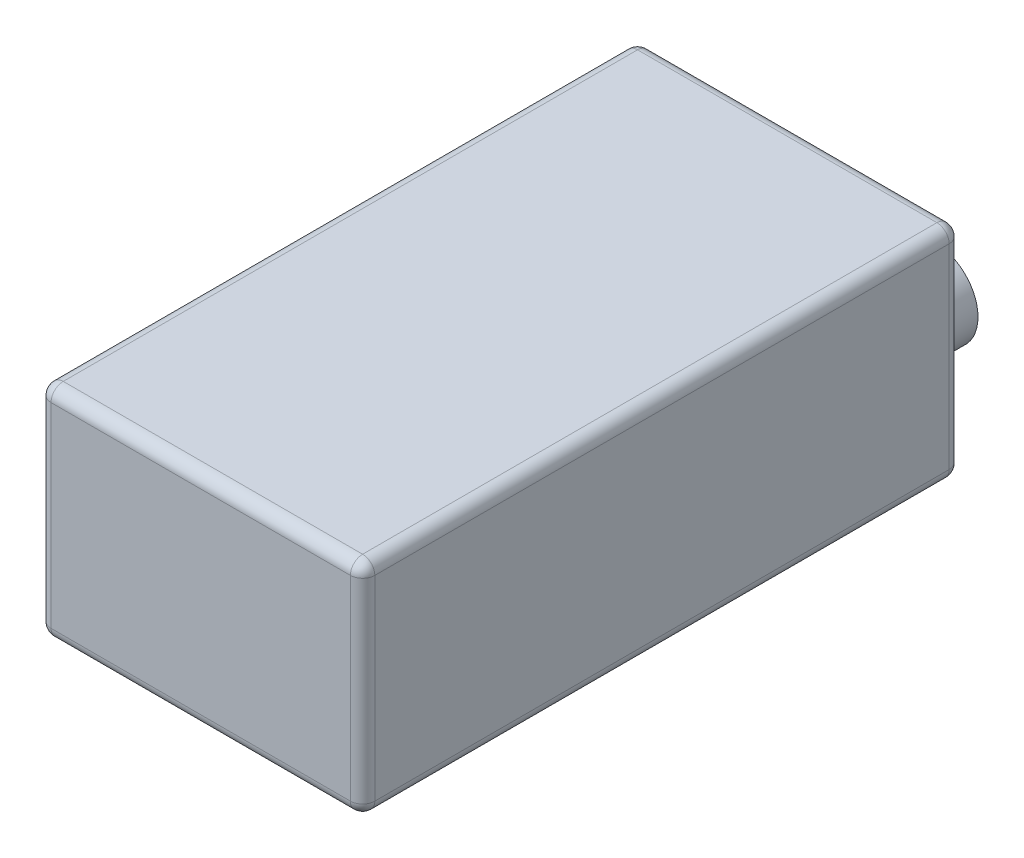
ISO-10303-21;
HEADER;
FILE_DESCRIPTION(('STEP AP214'),'2;1');
FILE_NAME('part.step','',(''),(''),'','','');
FILE_SCHEMA(('AUTOMOTIVE_DESIGN { 1 0 10303 214 1 1 1 1 }'));
ENDSEC;
DATA;
#1=APPLICATION_CONTEXT('core data for automotive mechanical design processes');
#2=APPLICATION_PROTOCOL_DEFINITION('international standard','automotive_design',2000,#1);
#3=PRODUCT_CONTEXT('',#1,'mechanical');
#4=PRODUCT('Part','Part','',(#3));
#5=PRODUCT_RELATED_PRODUCT_CATEGORY('part','',(#4));
#6=PRODUCT_DEFINITION_FORMATION('','',#4);
#7=PRODUCT_DEFINITION_CONTEXT('part definition',#1,'design');
#8=PRODUCT_DEFINITION('design','',#6,#7);
#9=PRODUCT_DEFINITION_SHAPE('','',#8);
#10=(LENGTH_UNIT() NAMED_UNIT(*) SI_UNIT(.MILLI.,.METRE.));
#11=(NAMED_UNIT(*) PLANE_ANGLE_UNIT() SI_UNIT($,.RADIAN.));
#12=(NAMED_UNIT(*) SI_UNIT($,.STERADIAN.) SOLID_ANGLE_UNIT());
#13=UNCERTAINTY_MEASURE_WITH_UNIT(LENGTH_MEASURE(1.E-05),#10,'distance_accuracy_value','');
#14=(GEOMETRIC_REPRESENTATION_CONTEXT(3) GLOBAL_UNCERTAINTY_ASSIGNED_CONTEXT((#13)) GLOBAL_UNIT_ASSIGNED_CONTEXT((#10,
#11,#12)) REPRESENTATION_CONTEXT('',''));
#15=CARTESIAN_POINT('',(0.,0.,0.));
#16=DIRECTION('',(0.,0.,1.));
#17=DIRECTION('',(1.,0.,0.));
#18=AXIS2_PLACEMENT_3D('',#15,#16,#17);
#19=CARTESIAN_POINT('',(13.25,18.,-24.5));
#20=DIRECTION('',(-1.,0.,0.));
#21=DIRECTION('',(0.,0.,1.));
#22=AXIS2_PLACEMENT_3D('',#19,#20,#21);
#23=PLANE('',#22);
#24=DIRECTION('',(0.,0.,-1.));
#25=VECTOR('',#24,1.);
#26=CARTESIAN_POINT('',(13.25,17.,24.5));
#27=LINE('',#26,#25);
#28=CARTESIAN_POINT('',(13.25,17.,-23.5));
#29=VERTEX_POINT('',#28);
#30=CARTESIAN_POINT('',(13.25,17.,23.5));
#31=VERTEX_POINT('',#30);
#32=EDGE_CURVE('E205',#29,#31,#27,.F.);
#33=ORIENTED_EDGE('',*,*,#32,.T.);
#34=DIRECTION('',(0.,-1.,0.));
#35=VECTOR('',#34,1.);
#36=CARTESIAN_POINT('',(13.25,18.,23.5));
#37=LINE('',#36,#35);
#38=CARTESIAN_POINT('',(13.25,1.,23.5));
#39=VERTEX_POINT('',#38);
#40=EDGE_CURVE('E212',#31,#39,#37,.T.);
#41=ORIENTED_EDGE('',*,*,#40,.T.);
#42=DIRECTION('',(0.,0.,-1.));
#43=VECTOR('',#42,1.);
#44=CARTESIAN_POINT('',(13.25,1.,-24.5));
#45=LINE('',#44,#43);
#46=CARTESIAN_POINT('',(13.25,1.,-23.5));
#47=VERTEX_POINT('',#46);
#48=EDGE_CURVE('E208',#39,#47,#45,.T.);
#49=ORIENTED_EDGE('',*,*,#48,.T.);
#50=DIRECTION('',(0.,-1.,0.));
#51=VECTOR('',#50,1.);
#52=CARTESIAN_POINT('',(13.25,18.,-23.5));
#53=LINE('',#52,#51);
#54=EDGE_CURVE('E202',#47,#29,#53,.F.);
#55=ORIENTED_EDGE('',*,*,#54,.T.);
#56=EDGE_LOOP('',(#33,#41,#49,#55));
#57=FACE_BOUND('',#56,.T.);
#58=ADVANCED_FACE('F39',(#57),#23,.F.);
#59=CARTESIAN_POINT('',(-13.25,18.,-24.5));
#60=DIRECTION('',(0.,0.,1.));
#61=DIRECTION('',(1.,0.,0.));
#62=AXIS2_PLACEMENT_3D('',#59,#60,#61);
#63=PLANE('',#62);
#64=CARTESIAN_POINT('',(-8.11326772272302,9.,-24.5));
#65=DIRECTION('',(0.,0.,1.));
#66=DIRECTION('',(1.,0.,0.));
#67=AXIS2_PLACEMENT_3D('',#64,#65,#66);
#68=CIRCLE('',#67,3.5);
#69=CARTESIAN_POINT('',(-4.61326772272302,9.,-24.5));
#70=VERTEX_POINT('',#69);
#71=EDGE_CURVE('E512',#70,#70,#68,.T.);
#72=ORIENTED_EDGE('',*,*,#71,.T.);
#73=EDGE_LOOP('',(#72));
#74=FACE_BOUND('',#73,.T.);
#75=CARTESIAN_POINT('',(8.11326772272302,9.,-24.5));
#76=DIRECTION('',(0.,0.,1.));
#77=DIRECTION('',(1.,0.,0.));
#78=AXIS2_PLACEMENT_3D('',#75,#76,#77);
#79=CIRCLE('',#78,3.5);
#80=CARTESIAN_POINT('',(11.613267722723,9.,-24.5));
#81=VERTEX_POINT('',#80);
#82=EDGE_CURVE('E11',#81,#81,#79,.F.);
#83=ORIENTED_EDGE('',*,*,#82,.F.);
#84=EDGE_LOOP('',(#83));
#85=FACE_BOUND('',#84,.T.);
#86=DIRECTION('',(0.,-1.,0.));
#87=VECTOR('',#86,1.);
#88=CARTESIAN_POINT('',(12.25,18.,-24.5));
#89=LINE('',#88,#87);
#90=CARTESIAN_POINT('',(12.25,17.,-24.5));
#91=VERTEX_POINT('',#90);
#92=CARTESIAN_POINT('',(12.25,1.,-24.5));
#93=VERTEX_POINT('',#92);
#94=EDGE_CURVE('E135',#91,#93,#89,.T.);
#95=ORIENTED_EDGE('',*,*,#94,.T.);
#96=DIRECTION('',(-1.,0.,0.));
#97=VECTOR('',#96,1.);
#98=CARTESIAN_POINT('',(-13.25,1.,-24.5));
#99=LINE('',#98,#97);
#100=CARTESIAN_POINT('',(-12.25,1.,-24.5));
#101=VERTEX_POINT('',#100);
#102=EDGE_CURVE('E173',#93,#101,#99,.T.);
#103=ORIENTED_EDGE('',*,*,#102,.T.);
#104=DIRECTION('',(0.,-1.,0.));
#105=VECTOR('',#104,1.);
#106=CARTESIAN_POINT('',(-12.25,18.,-24.5));
#107=LINE('',#106,#105);
#108=CARTESIAN_POINT('',(-12.25,17.,-24.5));
#109=VERTEX_POINT('',#108);
#110=EDGE_CURVE('E138',#101,#109,#107,.F.);
#111=ORIENTED_EDGE('',*,*,#110,.T.);
#112=DIRECTION('',(-1.,0.,0.));
#113=VECTOR('',#112,1.);
#114=CARTESIAN_POINT('',(13.25,17.,-24.5));
#115=LINE('',#114,#113);
#116=EDGE_CURVE('E131',#109,#91,#115,.F.);
#117=ORIENTED_EDGE('',*,*,#116,.T.);
#118=EDGE_LOOP('',(#95,#103,#111,#117));
#119=FACE_BOUND('',#118,.T.);
#120=ADVANCED_FACE('F132',(#74,#85,#119),#63,.F.);
#121=CARTESIAN_POINT('',(-13.25,18.,-24.5));
#122=DIRECTION('',(1.,0.,0.));
#123=DIRECTION('',(0.,0.,-1.));
#124=AXIS2_PLACEMENT_3D('',#121,#122,#123);
#125=PLANE('',#124);
#126=DIRECTION('',(0.,-1.,0.));
#127=VECTOR('',#126,1.);
#128=CARTESIAN_POINT('',(-13.25,18.,-23.5));
#129=LINE('',#128,#127);
#130=CARTESIAN_POINT('',(-13.25,17.,-23.5));
#131=VERTEX_POINT('',#130);
#132=CARTESIAN_POINT('',(-13.25,1.,-23.5));
#133=VERTEX_POINT('',#132);
#134=EDGE_CURVE('E195',#131,#133,#129,.T.);
#135=ORIENTED_EDGE('',*,*,#134,.T.);
#136=DIRECTION('',(0.,0.,1.));
#137=VECTOR('',#136,1.);
#138=CARTESIAN_POINT('',(-13.25,1.,-24.5));
#139=LINE('',#138,#137);
#140=CARTESIAN_POINT('',(-13.25,1.,23.5));
#141=VERTEX_POINT('',#140);
#142=EDGE_CURVE('E198',#133,#141,#139,.T.);
#143=ORIENTED_EDGE('',*,*,#142,.T.);
#144=DIRECTION('',(0.,-1.,0.));
#145=VECTOR('',#144,1.);
#146=CARTESIAN_POINT('',(-13.25,18.,23.5));
#147=LINE('',#146,#145);
#148=CARTESIAN_POINT('',(-13.25,17.,23.5));
#149=VERTEX_POINT('',#148);
#150=EDGE_CURVE('E189',#141,#149,#147,.F.);
#151=ORIENTED_EDGE('',*,*,#150,.T.);
#152=DIRECTION('',(0.,0.,1.));
#153=VECTOR('',#152,1.);
#154=CARTESIAN_POINT('',(-13.25,17.,-24.5));
#155=LINE('',#154,#153);
#156=EDGE_CURVE('E192',#149,#131,#155,.F.);
#157=ORIENTED_EDGE('',*,*,#156,.T.);
#158=EDGE_LOOP('',(#135,#143,#151,#157));
#159=FACE_BOUND('',#158,.T.);
#160=ADVANCED_FACE('F323',(#159),#125,.F.);
#161=CARTESIAN_POINT('',(-13.25,18.,24.5));
#162=DIRECTION('',(0.,0.,-1.));
#163=DIRECTION('',(-1.,0.,0.));
#164=AXIS2_PLACEMENT_3D('',#161,#162,#163);
#165=PLANE('',#164);
#166=DIRECTION('',(1.,0.,0.));
#167=VECTOR('',#166,1.);
#168=CARTESIAN_POINT('',(-13.25,1.,24.5));
#169=LINE('',#168,#167);
#170=CARTESIAN_POINT('',(-12.25,1.,24.5));
#171=VERTEX_POINT('',#170);
#172=CARTESIAN_POINT('',(12.25,1.,24.5));
#173=VERTEX_POINT('',#172);
#174=EDGE_CURVE('E221',#171,#173,#169,.T.);
#175=ORIENTED_EDGE('',*,*,#174,.T.);
#176=DIRECTION('',(0.,-1.,0.));
#177=VECTOR('',#176,1.);
#178=CARTESIAN_POINT('',(12.25,18.,24.5));
#179=LINE('',#178,#177);
#180=CARTESIAN_POINT('',(12.25,17.,24.5));
#181=VERTEX_POINT('',#180);
#182=EDGE_CURVE('E225',#173,#181,#179,.F.);
#183=ORIENTED_EDGE('',*,*,#182,.T.);
#184=DIRECTION('',(1.,0.,0.));
#185=VECTOR('',#184,1.);
#186=CARTESIAN_POINT('',(-13.25,17.,24.5));
#187=LINE('',#186,#185);
#188=CARTESIAN_POINT('',(-12.25,17.,24.5));
#189=VERTEX_POINT('',#188);
#190=EDGE_CURVE('E218',#181,#189,#187,.F.);
#191=ORIENTED_EDGE('',*,*,#190,.T.);
#192=DIRECTION('',(0.,-1.,0.));
#193=VECTOR('',#192,1.);
#194=CARTESIAN_POINT('',(-12.25,18.,24.5));
#195=LINE('',#194,#193);
#196=EDGE_CURVE('E215',#189,#171,#195,.T.);
#197=ORIENTED_EDGE('',*,*,#196,.T.);
#198=EDGE_LOOP('',(#175,#183,#191,#197));
#199=FACE_BOUND('',#198,.T.);
#200=ADVANCED_FACE('F332',(#199),#165,.F.);
#201=CARTESIAN_POINT('',(0.,18.,0.));
#202=DIRECTION('',(0.,1.,0.));
#203=DIRECTION('',(0.,0.,1.));
#204=AXIS2_PLACEMENT_3D('',#201,#202,#203);
#205=PLANE('',#204);
#206=DIRECTION('',(1.,0.,0.));
#207=VECTOR('',#206,1.);
#208=CARTESIAN_POINT('',(13.25,18.,23.5));
#209=LINE('',#208,#207);
#210=CARTESIAN_POINT('',(-12.25,18.,23.5));
#211=VERTEX_POINT('',#210);
#212=CARTESIAN_POINT('',(12.25,18.,23.5));
#213=VERTEX_POINT('',#212);
#214=EDGE_CURVE('E228',#211,#213,#209,.T.);
#215=ORIENTED_EDGE('',*,*,#214,.T.);
#216=DIRECTION('',(0.,0.,-1.));
#217=VECTOR('',#216,1.);
#218=CARTESIAN_POINT('',(12.25,18.,-24.5));
#219=LINE('',#218,#217);
#220=CARTESIAN_POINT('',(12.25,18.,-23.5));
#221=VERTEX_POINT('',#220);
#222=EDGE_CURVE('E48',#213,#221,#219,.T.);
#223=ORIENTED_EDGE('',*,*,#222,.T.);
#224=DIRECTION('',(-1.,0.,0.));
#225=VECTOR('',#224,1.);
#226=CARTESIAN_POINT('',(-13.25,18.,-23.5));
#227=LINE('',#226,#225);
#228=CARTESIAN_POINT('',(-12.25,18.,-23.5));
#229=VERTEX_POINT('',#228);
#230=EDGE_CURVE('E63',#221,#229,#227,.T.);
#231=ORIENTED_EDGE('',*,*,#230,.T.);
#232=DIRECTION('',(0.,0.,1.));
#233=VECTOR('',#232,1.);
#234=CARTESIAN_POINT('',(-12.25,18.,24.5));
#235=LINE('',#234,#233);
#236=EDGE_CURVE('E231',#229,#211,#235,.T.);
#237=ORIENTED_EDGE('',*,*,#236,.T.);
#238=EDGE_LOOP('',(#215,#223,#231,#237));
#239=FACE_BOUND('',#238,.T.);
#240=ADVANCED_FACE('F355',(#239),#205,.T.);
#241=CARTESIAN_POINT('',(0.,0.,0.));
#242=DIRECTION('',(0.,1.,0.));
#243=DIRECTION('',(0.,0.,1.));
#244=AXIS2_PLACEMENT_3D('',#241,#242,#243);
#245=PLANE('',#244);
#246=DIRECTION('',(0.,0.,1.));
#247=VECTOR('',#246,1.);
#248=CARTESIAN_POINT('',(-12.25,0.,0.));
#249=LINE('',#248,#247);
#250=CARTESIAN_POINT('',(-12.25,0.,23.5));
#251=VERTEX_POINT('',#250);
#252=CARTESIAN_POINT('',(-12.25,0.,-23.5));
#253=VERTEX_POINT('',#252);
#254=EDGE_CURVE('E182',#251,#253,#249,.F.);
#255=ORIENTED_EDGE('',*,*,#254,.T.);
#256=DIRECTION('',(-1.,0.,0.));
#257=VECTOR('',#256,1.);
#258=CARTESIAN_POINT('',(0.,0.,-23.5));
#259=LINE('',#258,#257);
#260=CARTESIAN_POINT('',(12.25,0.,-23.5));
#261=VERTEX_POINT('',#260);
#262=EDGE_CURVE('E185',#253,#261,#259,.F.);
#263=ORIENTED_EDGE('',*,*,#262,.T.);
#264=DIRECTION('',(0.,0.,-1.));
#265=VECTOR('',#264,1.);
#266=CARTESIAN_POINT('',(12.25,0.,0.));
#267=LINE('',#266,#265);
#268=CARTESIAN_POINT('',(12.25,0.,23.5));
#269=VERTEX_POINT('',#268);
#270=EDGE_CURVE('E179',#261,#269,#267,.F.);
#271=ORIENTED_EDGE('',*,*,#270,.T.);
#272=DIRECTION('',(1.,0.,0.));
#273=VECTOR('',#272,1.);
#274=CARTESIAN_POINT('',(0.,0.,23.5));
#275=LINE('',#274,#273);
#276=EDGE_CURVE('E176',#269,#251,#275,.F.);
#277=ORIENTED_EDGE('',*,*,#276,.T.);
#278=EDGE_LOOP('',(#255,#263,#271,#277));
#279=FACE_BOUND('',#278,.T.);
#280=ADVANCED_FACE('F357',(#279),#245,.F.);
#281=CARTESIAN_POINT('',(0.,17.,23.5));
#282=DIRECTION('',(-1.,0.,0.));
#283=DIRECTION('',(0.,0.,1.));
#284=AXIS2_PLACEMENT_3D('',#281,#282,#283);
#285=CYLINDRICAL_SURFACE('',#284,1.);
#286=CARTESIAN_POINT('',(12.25,17.,23.5));
#287=DIRECTION('',(1.,0.,0.));
#288=DIRECTION('',(0.,0.,-1.));
#289=AXIS2_PLACEMENT_3D('',#286,#287,#288);
#290=CIRCLE('',#289,1.);
#291=EDGE_CURVE('E162',#213,#181,#290,.T.);
#292=ORIENTED_EDGE('',*,*,#291,.F.);
#293=ORIENTED_EDGE('',*,*,#214,.F.);
#294=CARTESIAN_POINT('',(-12.25,17.,23.5));
#295=DIRECTION('',(-1.,0.,0.));
#296=DIRECTION('',(0.,0.,1.));
#297=AXIS2_PLACEMENT_3D('',#294,#295,#296);
#298=CIRCLE('',#297,1.);
#299=EDGE_CURVE('E166',#189,#211,#298,.T.);
#300=ORIENTED_EDGE('',*,*,#299,.F.);
#301=ORIENTED_EDGE('',*,*,#190,.F.);
#302=EDGE_LOOP('',(#292,#293,#300,#301));
#303=FACE_BOUND('',#302,.T.);
#304=ADVANCED_FACE('F41',(#303),#285,.T.);
#305=CARTESIAN_POINT('',(12.25,17.,23.5));
#306=DIRECTION('',(0.,0.,1.));
#307=DIRECTION('',(1.,0.,0.));
#308=AXIS2_PLACEMENT_3D('',#305,#306,#307);
#309=SPHERICAL_SURFACE('',#308,1.);
#310=CARTESIAN_POINT('',(12.25,17.,23.5));
#311=DIRECTION('',(0.,0.,1.));
#312=DIRECTION('',(1.,0.,0.));
#313=AXIS2_PLACEMENT_3D('',#310,#311,#312);
#314=CIRCLE('',#313,1.);
#315=EDGE_CURVE('E298',#213,#31,#314,.F.);
#316=ORIENTED_EDGE('',*,*,#315,.F.);
#317=ORIENTED_EDGE('',*,*,#291,.T.);
#318=CARTESIAN_POINT('',(12.25,17.,23.5));
#319=DIRECTION('',(0.,1.,0.));
#320=DIRECTION('',(0.,0.,1.));
#321=AXIS2_PLACEMENT_3D('',#318,#319,#320);
#322=CIRCLE('',#321,1.);
#323=EDGE_CURVE('E302',#31,#181,#322,.F.);
#324=ORIENTED_EDGE('',*,*,#323,.F.);
#325=EDGE_LOOP('',(#316,#317,#324));
#326=FACE_BOUND('',#325,.T.);
#327=ADVANCED_FACE('F350',(#326),#309,.T.);
#328=CARTESIAN_POINT('',(-12.25,17.,23.5));
#329=DIRECTION('',(0.,1.,0.));
#330=DIRECTION('',(0.,0.,1.));
#331=AXIS2_PLACEMENT_3D('',#328,#329,#330);
#332=SPHERICAL_SURFACE('',#331,1.);
#333=CARTESIAN_POINT('',(-12.25,17.,23.5));
#334=DIRECTION('',(0.,1.,0.));
#335=DIRECTION('',(0.,0.,1.));
#336=AXIS2_PLACEMENT_3D('',#333,#334,#335);
#337=CIRCLE('',#336,1.);
#338=EDGE_CURVE('E290',#189,#149,#337,.F.);
#339=ORIENTED_EDGE('',*,*,#338,.F.);
#340=ORIENTED_EDGE('',*,*,#299,.T.);
#341=CARTESIAN_POINT('',(-12.25,17.,23.5));
#342=DIRECTION('',(0.,0.,1.));
#343=DIRECTION('',(1.,0.,0.));
#344=AXIS2_PLACEMENT_3D('',#341,#342,#343);
#345=CIRCLE('',#344,1.);
#346=EDGE_CURVE('E294',#149,#211,#345,.F.);
#347=ORIENTED_EDGE('',*,*,#346,.F.);
#348=EDGE_LOOP('',(#339,#340,#347));
#349=FACE_BOUND('',#348,.T.);
#350=ADVANCED_FACE('F312',(#349),#332,.T.);
#351=CARTESIAN_POINT('',(12.25,18.,23.5));
#352=DIRECTION('',(0.,-1.,0.));
#353=DIRECTION('',(0.,0.,-1.));
#354=AXIS2_PLACEMENT_3D('',#351,#352,#353);
#355=CYLINDRICAL_SURFACE('',#354,1.);
#356=ORIENTED_EDGE('',*,*,#323,.T.);
#357=ORIENTED_EDGE('',*,*,#182,.F.);
#358=CARTESIAN_POINT('',(12.25,1.,23.5));
#359=DIRECTION('',(0.,-1.,0.));
#360=DIRECTION('',(0.,0.,-1.));
#361=AXIS2_PLACEMENT_3D('',#358,#359,#360);
#362=CIRCLE('',#361,1.);
#363=EDGE_CURVE('E283',#39,#173,#362,.T.);
#364=ORIENTED_EDGE('',*,*,#363,.F.);
#365=ORIENTED_EDGE('',*,*,#40,.F.);
#366=EDGE_LOOP('',(#356,#357,#364,#365));
#367=FACE_BOUND('',#366,.T.);
#368=ADVANCED_FACE('F344',(#367),#355,.T.);
#369=CARTESIAN_POINT('',(12.25,17.,0.));
#370=DIRECTION('',(0.,0.,1.));
#371=DIRECTION('',(1.,0.,0.));
#372=AXIS2_PLACEMENT_3D('',#369,#370,#371);
#373=CYLINDRICAL_SURFACE('',#372,1.);
#374=ORIENTED_EDGE('',*,*,#315,.T.);
#375=ORIENTED_EDGE('',*,*,#32,.F.);
#376=CARTESIAN_POINT('',(12.25,17.,-23.5));
#377=DIRECTION('',(0.,0.,-1.));
#378=DIRECTION('',(-1.,0.,0.));
#379=AXIS2_PLACEMENT_3D('',#376,#377,#378);
#380=CIRCLE('',#379,1.);
#381=EDGE_CURVE('E146',#221,#29,#380,.T.);
#382=ORIENTED_EDGE('',*,*,#381,.F.);
#383=ORIENTED_EDGE('',*,*,#222,.F.);
#384=EDGE_LOOP('',(#374,#375,#382,#383));
#385=FACE_BOUND('',#384,.T.);
#386=ADVANCED_FACE('F354',(#385),#373,.T.);
#387=CARTESIAN_POINT('',(0.,17.,-23.5));
#388=DIRECTION('',(1.,0.,0.));
#389=DIRECTION('',(0.,0.,-1.));
#390=AXIS2_PLACEMENT_3D('',#387,#388,#389);
#391=CYLINDRICAL_SURFACE('',#390,1.);
#392=CARTESIAN_POINT('',(-12.25,17.,-23.5));
#393=DIRECTION('',(-1.,0.,0.));
#394=DIRECTION('',(0.,0.,1.));
#395=AXIS2_PLACEMENT_3D('',#392,#393,#394);
#396=CIRCLE('',#395,1.);
#397=EDGE_CURVE('E147',#229,#109,#396,.T.);
#398=ORIENTED_EDGE('',*,*,#397,.F.);
#399=ORIENTED_EDGE('',*,*,#230,.F.);
#400=CARTESIAN_POINT('',(12.25,17.,-23.5));
#401=DIRECTION('',(1.,0.,0.));
#402=DIRECTION('',(0.,1.,0.));
#403=AXIS2_PLACEMENT_3D('',#400,#401,#402);
#404=CIRCLE('',#403,1.);
#405=EDGE_CURVE('E55',#91,#221,#404,.T.);
#406=ORIENTED_EDGE('',*,*,#405,.F.);
#407=ORIENTED_EDGE('',*,*,#116,.F.);
#408=EDGE_LOOP('',(#398,#399,#406,#407));
#409=FACE_BOUND('',#408,.T.);
#410=ADVANCED_FACE('F144',(#409),#391,.T.);
#411=CARTESIAN_POINT('',(-12.25,17.,0.));
#412=DIRECTION('',(0.,0.,-1.));
#413=DIRECTION('',(-1.,0.,0.));
#414=AXIS2_PLACEMENT_3D('',#411,#412,#413);
#415=CYLINDRICAL_SURFACE('',#414,1.);
#416=ORIENTED_EDGE('',*,*,#346,.T.);
#417=ORIENTED_EDGE('',*,*,#236,.F.);
#418=CARTESIAN_POINT('',(-12.25,17.,-23.5));
#419=DIRECTION('',(0.,0.,-1.));
#420=DIRECTION('',(-1.,0.,0.));
#421=AXIS2_PLACEMENT_3D('',#418,#419,#420);
#422=CIRCLE('',#421,1.);
#423=EDGE_CURVE('E275',#131,#229,#422,.T.);
#424=ORIENTED_EDGE('',*,*,#423,.F.);
#425=ORIENTED_EDGE('',*,*,#156,.F.);
#426=EDGE_LOOP('',(#416,#417,#424,#425));
#427=FACE_BOUND('',#426,.T.);
#428=ADVANCED_FACE('F319',(#427),#415,.T.);
#429=CARTESIAN_POINT('',(-12.25,18.,23.5));
#430=DIRECTION('',(0.,-1.,0.));
#431=DIRECTION('',(0.,0.,-1.));
#432=AXIS2_PLACEMENT_3D('',#429,#430,#431);
#433=CYLINDRICAL_SURFACE('',#432,1.);
#434=ORIENTED_EDGE('',*,*,#338,.T.);
#435=ORIENTED_EDGE('',*,*,#150,.F.);
#436=CARTESIAN_POINT('',(-12.25,1.,23.5));
#437=DIRECTION('',(0.,-1.,0.));
#438=DIRECTION('',(0.,0.,-1.));
#439=AXIS2_PLACEMENT_3D('',#436,#437,#438);
#440=CIRCLE('',#439,1.);
#441=EDGE_CURVE('E271',#171,#141,#440,.T.);
#442=ORIENTED_EDGE('',*,*,#441,.F.);
#443=ORIENTED_EDGE('',*,*,#196,.F.);
#444=EDGE_LOOP('',(#434,#435,#442,#443));
#445=FACE_BOUND('',#444,.T.);
#446=ADVANCED_FACE('F329',(#445),#433,.T.);
#447=CARTESIAN_POINT('',(-13.25,1.,23.5));
#448=DIRECTION('',(1.,0.,0.));
#449=DIRECTION('',(0.,0.,-1.));
#450=AXIS2_PLACEMENT_3D('',#447,#448,#449);
#451=CYLINDRICAL_SURFACE('',#450,1.);
#452=CARTESIAN_POINT('',(12.25,1.,23.5));
#453=DIRECTION('',(1.,0.,0.));
#454=DIRECTION('',(0.,0.,-1.));
#455=AXIS2_PLACEMENT_3D('',#452,#453,#454);
#456=CIRCLE('',#455,1.);
#457=EDGE_CURVE('E286',#173,#269,#456,.T.);
#458=ORIENTED_EDGE('',*,*,#457,.F.);
#459=ORIENTED_EDGE('',*,*,#174,.F.);
#460=CARTESIAN_POINT('',(-12.25,1.,23.5));
#461=DIRECTION('',(-1.,0.,0.));
#462=DIRECTION('',(0.,0.,1.));
#463=AXIS2_PLACEMENT_3D('',#460,#461,#462);
#464=CIRCLE('',#463,1.);
#465=EDGE_CURVE('E267',#251,#171,#464,.T.);
#466=ORIENTED_EDGE('',*,*,#465,.F.);
#467=ORIENTED_EDGE('',*,*,#276,.F.);
#468=EDGE_LOOP('',(#458,#459,#466,#467));
#469=FACE_BOUND('',#468,.T.);
#470=ADVANCED_FACE('F336',(#469),#451,.T.);
#471=CARTESIAN_POINT('',(12.25,1.,23.5));
#472=DIRECTION('',(0.,0.,1.));
#473=DIRECTION('',(0.,-1.,0.));
#474=AXIS2_PLACEMENT_3D('',#471,#472,#473);
#475=SPHERICAL_SURFACE('',#474,1.);
#476=ORIENTED_EDGE('',*,*,#363,.T.);
#477=ORIENTED_EDGE('',*,*,#457,.T.);
#478=CARTESIAN_POINT('',(12.25,1.,23.5));
#479=DIRECTION('',(0.,0.,1.));
#480=DIRECTION('',(1.,0.,0.));
#481=AXIS2_PLACEMENT_3D('',#478,#479,#480);
#482=CIRCLE('',#481,1.);
#483=EDGE_CURVE('E155',#39,#269,#482,.F.);
#484=ORIENTED_EDGE('',*,*,#483,.F.);
#485=EDGE_LOOP('',(#476,#477,#484));
#486=FACE_BOUND('',#485,.T.);
#487=ADVANCED_FACE('F414',(#486),#475,.T.);
#488=CARTESIAN_POINT('',(12.25,17.,-23.5));
#489=DIRECTION('',(0.,1.,0.));
#490=DIRECTION('',(0.,0.,1.));
#491=AXIS2_PLACEMENT_3D('',#488,#489,#490);
#492=SPHERICAL_SURFACE('',#491,1.);
#493=ORIENTED_EDGE('',*,*,#405,.T.);
#494=ORIENTED_EDGE('',*,*,#381,.T.);
#495=CARTESIAN_POINT('',(12.25,17.,-23.5));
#496=DIRECTION('',(0.,1.,0.));
#497=DIRECTION('',(0.,0.,1.));
#498=AXIS2_PLACEMENT_3D('',#495,#496,#497);
#499=CIRCLE('',#498,1.);
#500=EDGE_CURVE('E150',#91,#29,#499,.F.);
#501=ORIENTED_EDGE('',*,*,#500,.F.);
#502=EDGE_LOOP('',(#493,#494,#501));
#503=FACE_BOUND('',#502,.T.);
#504=ADVANCED_FACE('F151',(#503),#492,.T.);
#505=CARTESIAN_POINT('',(-12.25,17.,-23.5));
#506=DIRECTION('',(0.,1.,0.));
#507=DIRECTION('',(0.,0.,1.));
#508=AXIS2_PLACEMENT_3D('',#505,#506,#507);
#509=SPHERICAL_SURFACE('',#508,1.);
#510=ORIENTED_EDGE('',*,*,#423,.T.);
#511=ORIENTED_EDGE('',*,*,#397,.T.);
#512=CARTESIAN_POINT('',(-12.25,17.,-23.5));
#513=DIRECTION('',(0.,1.,0.));
#514=DIRECTION('',(0.,0.,1.));
#515=AXIS2_PLACEMENT_3D('',#512,#513,#514);
#516=CIRCLE('',#515,1.);
#517=EDGE_CURVE('E156',#131,#109,#516,.F.);
#518=ORIENTED_EDGE('',*,*,#517,.F.);
#519=EDGE_LOOP('',(#510,#511,#518));
#520=FACE_BOUND('',#519,.T.);
#521=ADVANCED_FACE('F407',(#520),#509,.T.);
#522=CARTESIAN_POINT('',(-12.25,1.,23.5));
#523=DIRECTION('',(0.,0.,1.));
#524=DIRECTION('',(0.,-1.,0.));
#525=AXIS2_PLACEMENT_3D('',#522,#523,#524);
#526=SPHERICAL_SURFACE('',#525,1.);
#527=ORIENTED_EDGE('',*,*,#465,.T.);
#528=ORIENTED_EDGE('',*,*,#441,.T.);
#529=CARTESIAN_POINT('',(-12.25,1.,23.5));
#530=DIRECTION('',(0.,0.,1.));
#531=DIRECTION('',(1.,0.,0.));
#532=AXIS2_PLACEMENT_3D('',#529,#530,#531);
#533=CIRCLE('',#532,1.);
#534=EDGE_CURVE('E258',#251,#141,#533,.F.);
#535=ORIENTED_EDGE('',*,*,#534,.F.);
#536=EDGE_LOOP('',(#527,#528,#535));
#537=FACE_BOUND('',#536,.T.);
#538=ADVANCED_FACE('F403',(#537),#526,.T.);
#539=CARTESIAN_POINT('',(12.25,1.,-24.5));
#540=DIRECTION('',(0.,0.,-1.));
#541=DIRECTION('',(-1.,0.,0.));
#542=AXIS2_PLACEMENT_3D('',#539,#540,#541);
#543=CYLINDRICAL_SURFACE('',#542,1.);
#544=ORIENTED_EDGE('',*,*,#483,.T.);
#545=ORIENTED_EDGE('',*,*,#270,.F.);
#546=CARTESIAN_POINT('',(12.25,1.,-23.5));
#547=DIRECTION('',(0.,0.,-1.));
#548=DIRECTION('',(-1.,0.,0.));
#549=AXIS2_PLACEMENT_3D('',#546,#547,#548);
#550=CIRCLE('',#549,1.);
#551=EDGE_CURVE('E254',#47,#261,#550,.T.);
#552=ORIENTED_EDGE('',*,*,#551,.F.);
#553=ORIENTED_EDGE('',*,*,#48,.F.);
#554=EDGE_LOOP('',(#544,#545,#552,#553));
#555=FACE_BOUND('',#554,.T.);
#556=ADVANCED_FACE('F400',(#555),#543,.T.);
#557=CARTESIAN_POINT('',(12.25,18.,-23.5));
#558=DIRECTION('',(0.,-1.,0.));
#559=DIRECTION('',(0.,0.,-1.));
#560=AXIS2_PLACEMENT_3D('',#557,#558,#559);
#561=CYLINDRICAL_SURFACE('',#560,1.);
#562=ORIENTED_EDGE('',*,*,#500,.T.);
#563=ORIENTED_EDGE('',*,*,#54,.F.);
#564=CARTESIAN_POINT('',(12.25,1.,-23.5));
#565=DIRECTION('',(0.,-1.,0.));
#566=DIRECTION('',(0.,0.,-1.));
#567=AXIS2_PLACEMENT_3D('',#564,#565,#566);
#568=CIRCLE('',#567,1.);
#569=EDGE_CURVE('E159',#93,#47,#568,.T.);
#570=ORIENTED_EDGE('',*,*,#569,.F.);
#571=ORIENTED_EDGE('',*,*,#94,.F.);
#572=EDGE_LOOP('',(#562,#563,#570,#571));
#573=FACE_BOUND('',#572,.T.);
#574=ADVANCED_FACE('F158',(#573),#561,.T.);
#575=CARTESIAN_POINT('',(-12.25,18.,-23.5));
#576=DIRECTION('',(0.,-1.,0.));
#577=DIRECTION('',(0.,0.,-1.));
#578=AXIS2_PLACEMENT_3D('',#575,#576,#577);
#579=CYLINDRICAL_SURFACE('',#578,1.);
#580=ORIENTED_EDGE('',*,*,#517,.T.);
#581=ORIENTED_EDGE('',*,*,#110,.F.);
#582=CARTESIAN_POINT('',(-12.25,1.,-23.5));
#583=DIRECTION('',(0.,-1.,0.));
#584=DIRECTION('',(0.,0.,-1.));
#585=AXIS2_PLACEMENT_3D('',#582,#583,#584);
#586=CIRCLE('',#585,1.);
#587=EDGE_CURVE('E248',#133,#101,#586,.T.);
#588=ORIENTED_EDGE('',*,*,#587,.F.);
#589=ORIENTED_EDGE('',*,*,#134,.F.);
#590=EDGE_LOOP('',(#580,#581,#588,#589));
#591=FACE_BOUND('',#590,.T.);
#592=ADVANCED_FACE('F393',(#591),#579,.T.);
#593=CARTESIAN_POINT('',(-12.25,1.,-24.5));
#594=DIRECTION('',(0.,0.,1.));
#595=DIRECTION('',(1.,0.,0.));
#596=AXIS2_PLACEMENT_3D('',#593,#594,#595);
#597=CYLINDRICAL_SURFACE('',#596,1.);
#598=ORIENTED_EDGE('',*,*,#534,.T.);
#599=ORIENTED_EDGE('',*,*,#142,.F.);
#600=CARTESIAN_POINT('',(-12.25,1.,-23.5));
#601=DIRECTION('',(0.,0.,-1.));
#602=DIRECTION('',(-1.,0.,0.));
#603=AXIS2_PLACEMENT_3D('',#600,#601,#602);
#604=CIRCLE('',#603,1.);
#605=EDGE_CURVE('E244',#253,#133,#604,.T.);
#606=ORIENTED_EDGE('',*,*,#605,.F.);
#607=ORIENTED_EDGE('',*,*,#254,.F.);
#608=EDGE_LOOP('',(#598,#599,#606,#607));
#609=FACE_BOUND('',#608,.T.);
#610=ADVANCED_FACE('F389',(#609),#597,.T.);
#611=CARTESIAN_POINT('',(12.25,1.,-23.5));
#612=DIRECTION('',(1.,0.,0.));
#613=DIRECTION('',(0.,1.,0.));
#614=AXIS2_PLACEMENT_3D('',#611,#612,#613);
#615=SPHERICAL_SURFACE('',#614,1.);
#616=ORIENTED_EDGE('',*,*,#569,.T.);
#617=ORIENTED_EDGE('',*,*,#551,.T.);
#618=CARTESIAN_POINT('',(12.25,1.,-23.5));
#619=DIRECTION('',(1.,0.,0.));
#620=DIRECTION('',(0.,0.,-1.));
#621=AXIS2_PLACEMENT_3D('',#618,#619,#620);
#622=CIRCLE('',#621,1.);
#623=EDGE_CURVE('E241',#93,#261,#622,.F.);
#624=ORIENTED_EDGE('',*,*,#623,.F.);
#625=EDGE_LOOP('',(#616,#617,#624));
#626=FACE_BOUND('',#625,.T.);
#627=ADVANCED_FACE('F385',(#626),#615,.T.);
#628=CARTESIAN_POINT('',(-12.25,1.,-23.5));
#629=DIRECTION('',(-1.,0.,0.));
#630=DIRECTION('',(0.,-1.,0.));
#631=AXIS2_PLACEMENT_3D('',#628,#629,#630);
#632=SPHERICAL_SURFACE('',#631,1.);
#633=ORIENTED_EDGE('',*,*,#605,.T.);
#634=ORIENTED_EDGE('',*,*,#587,.T.);
#635=CARTESIAN_POINT('',(-12.25,1.,-23.5));
#636=DIRECTION('',(-1.,0.,0.));
#637=DIRECTION('',(0.,0.,1.));
#638=AXIS2_PLACEMENT_3D('',#635,#636,#637);
#639=CIRCLE('',#638,1.);
#640=EDGE_CURVE('E238',#253,#101,#639,.F.);
#641=ORIENTED_EDGE('',*,*,#640,.F.);
#642=EDGE_LOOP('',(#633,#634,#641));
#643=FACE_BOUND('',#642,.T.);
#644=ADVANCED_FACE('F381',(#643),#632,.T.);
#645=CARTESIAN_POINT('',(-13.25,1.,-23.5));
#646=DIRECTION('',(-1.,0.,0.));
#647=DIRECTION('',(0.,0.,1.));
#648=AXIS2_PLACEMENT_3D('',#645,#646,#647);
#649=CYLINDRICAL_SURFACE('',#648,1.);
#650=ORIENTED_EDGE('',*,*,#623,.T.);
#651=ORIENTED_EDGE('',*,*,#262,.F.);
#652=ORIENTED_EDGE('',*,*,#640,.T.);
#653=ORIENTED_EDGE('',*,*,#102,.F.);
#654=EDGE_LOOP('',(#650,#651,#652,#653));
#655=FACE_BOUND('',#654,.T.);
#656=ADVANCED_FACE('F377',(#655),#649,.T.);
#657=CARTESIAN_POINT('',(8.11326772272302,9.,-27.5));
#658=DIRECTION('',(0.,0.,1.));
#659=DIRECTION('',(1.,0.,0.));
#660=AXIS2_PLACEMENT_3D('',#657,#658,#659);
#661=CYLINDRICAL_SURFACE('',#660,3.5);
#662=CARTESIAN_POINT('',(8.11326772272302,9.,-27.5));
#663=DIRECTION('',(0.,0.,-1.));
#664=DIRECTION('',(-1.,0.,0.));
#665=AXIS2_PLACEMENT_3D('',#662,#663,#664);
#666=CIRCLE('',#665,3.5);
#667=CARTESIAN_POINT('',(4.61326772272302,9.,-27.5));
#668=VERTEX_POINT('',#667);
#669=EDGE_CURVE('E168',#668,#668,#666,.T.);
#670=ORIENTED_EDGE('',*,*,#669,.F.);
#671=EDGE_LOOP('',(#670));
#672=FACE_BOUND('',#671,.T.);
#673=ORIENTED_EDGE('',*,*,#82,.T.);
#674=EDGE_LOOP('',(#673));
#675=FACE_BOUND('',#674,.T.);
#676=ADVANCED_FACE('F380',(#672,#675),#661,.T.);
#677=CARTESIAN_POINT('',(8.11326772272302,9.,-27.5));
#678=DIRECTION('',(0.,0.,-1.));
#679=DIRECTION('',(-1.,0.,0.));
#680=AXIS2_PLACEMENT_3D('',#677,#678,#679);
#681=PLANE('',#680);
#682=ORIENTED_EDGE('',*,*,#669,.T.);
#683=EDGE_LOOP('',(#682));
#684=FACE_BOUND('',#683,.T.);
#685=ADVANCED_FACE('F473',(#684),#681,.T.);
#686=CARTESIAN_POINT('',(-8.11326772272302,9.,-27.5));
#687=DIRECTION('',(0.,0.,1.));
#688=DIRECTION('',(1.,0.,0.));
#689=AXIS2_PLACEMENT_3D('',#686,#687,#688);
#690=CYLINDRICAL_SURFACE('',#689,3.5);
#691=CARTESIAN_POINT('',(-8.11326772272302,9.,-27.5));
#692=DIRECTION('',(0.,0.,1.));
#693=DIRECTION('',(1.,0.,0.));
#694=AXIS2_PLACEMENT_3D('',#691,#692,#693);
#695=CIRCLE('',#694,3.5);
#696=CARTESIAN_POINT('',(-4.61326772272302,9.,-27.5));
#697=VERTEX_POINT('',#696);
#698=EDGE_CURVE('E509',#697,#697,#695,.T.);
#699=ORIENTED_EDGE('',*,*,#698,.T.);
#700=EDGE_LOOP('',(#699));
#701=FACE_BOUND('',#700,.T.);
#702=ORIENTED_EDGE('',*,*,#71,.F.);
#703=EDGE_LOOP('',(#702));
#704=FACE_BOUND('',#703,.T.);
#705=ADVANCED_FACE('F478',(#701,#704),#690,.T.);
#706=CARTESIAN_POINT('',(-8.11326772272302,9.,-27.5));
#707=DIRECTION('',(0.,0.,-1.));
#708=DIRECTION('',(1.,0.,0.));
#709=AXIS2_PLACEMENT_3D('',#706,#707,#708);
#710=PLANE('',#709);
#711=ORIENTED_EDGE('',*,*,#698,.F.);
#712=EDGE_LOOP('',(#711));
#713=FACE_BOUND('',#712,.T.);
#714=ADVANCED_FACE('F483',(#713),#710,.T.);
#715=CLOSED_SHELL('',(#58,#120,#160,#200,#240,#280,#304,#327,#350,#368,#386,#410,#428,#446,#470,
#487,#504,#521,#538,#556,#574,#592,#610,#627,#644,#656,#676,#685,#705,#714));
#716=MANIFOLD_SOLID_BREP('B2',#715);
#717=ADVANCED_BREP_SHAPE_REPRESENTATION('',(#18,#716),#14);
#718=SHAPE_DEFINITION_REPRESENTATION(#9,#717);
ENDSEC;
END-ISO-10303-21;
